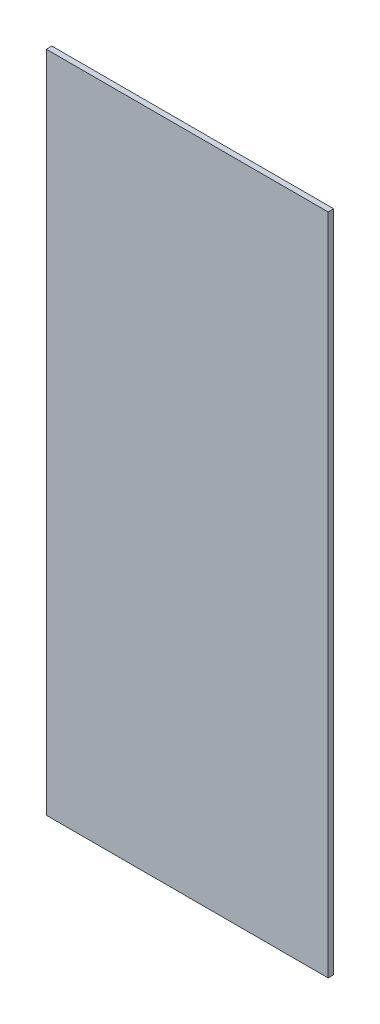
ISO-10303-21;
HEADER;
FILE_DESCRIPTION(('STEP AP214'),'2;1');
FILE_NAME('part.step','',(''),(''),'','','');
FILE_SCHEMA(('AUTOMOTIVE_DESIGN { 1 0 10303 214 1 1 1 1 }'));
ENDSEC;
DATA;
#1=APPLICATION_CONTEXT('core data for automotive mechanical design processes');
#2=APPLICATION_PROTOCOL_DEFINITION('international standard','automotive_design',2000,#1);
#3=PRODUCT_CONTEXT('',#1,'mechanical');
#4=PRODUCT('Part','Part','',(#3));
#5=PRODUCT_RELATED_PRODUCT_CATEGORY('part','',(#4));
#6=PRODUCT_DEFINITION_FORMATION('','',#4);
#7=PRODUCT_DEFINITION_CONTEXT('part definition',#1,'design');
#8=PRODUCT_DEFINITION('design','',#6,#7);
#9=PRODUCT_DEFINITION_SHAPE('','',#8);
#10=(LENGTH_UNIT() NAMED_UNIT(*) SI_UNIT(.MILLI.,.METRE.));
#11=(NAMED_UNIT(*) PLANE_ANGLE_UNIT() SI_UNIT($,.RADIAN.));
#12=(NAMED_UNIT(*) SI_UNIT($,.STERADIAN.) SOLID_ANGLE_UNIT());
#13=UNCERTAINTY_MEASURE_WITH_UNIT(LENGTH_MEASURE(1.E-05),#10,'distance_accuracy_value','');
#14=(GEOMETRIC_REPRESENTATION_CONTEXT(3) GLOBAL_UNCERTAINTY_ASSIGNED_CONTEXT((#13)) GLOBAL_UNIT_ASSIGNED_CONTEXT((#10,
#11,#12)) REPRESENTATION_CONTEXT('',''));
#15=CARTESIAN_POINT('',(0.,0.,0.));
#16=DIRECTION('',(0.,0.,1.));
#17=DIRECTION('',(1.,0.,0.));
#18=AXIS2_PLACEMENT_3D('',#15,#16,#17);
#19=CARTESIAN_POINT('',(0.,0.,12.7));
#20=DIRECTION('',(-1.,0.,0.));
#21=DIRECTION('',(0.,-1.,0.));
#22=AXIS2_PLACEMENT_3D('',#19,#20,#21);
#23=PLANE('',#22);
#24=DIRECTION('',(0.,1.,0.));
#25=VECTOR('',#24,1.);
#26=CARTESIAN_POINT('',(0.,0.,0.));
#27=LINE('',#26,#25);
#28=CARTESIAN_POINT('',(0.,0.,0.));
#29=VERTEX_POINT('',#28);
#30=CARTESIAN_POINT('',(0.,1524.,0.));
#31=VERTEX_POINT('',#30);
#32=EDGE_CURVE('E95',#29,#31,#27,.T.);
#33=ORIENTED_EDGE('',*,*,#32,.T.);
#34=DIRECTION('',(0.,0.,-1.));
#35=VECTOR('',#34,1.);
#36=CARTESIAN_POINT('',(0.,1524.,12.7));
#37=LINE('',#36,#35);
#38=CARTESIAN_POINT('',(0.,1524.,12.7));
#39=VERTEX_POINT('',#38);
#40=EDGE_CURVE('E11',#39,#31,#37,.T.);
#41=ORIENTED_EDGE('',*,*,#40,.F.);
#42=DIRECTION('',(0.,1.,0.));
#43=VECTOR('',#42,1.);
#44=CARTESIAN_POINT('',(0.,0.,12.7));
#45=LINE('',#44,#43);
#46=CARTESIAN_POINT('',(0.,0.,12.7));
#47=VERTEX_POINT('',#46);
#48=EDGE_CURVE('E83',#47,#39,#45,.T.);
#49=ORIENTED_EDGE('',*,*,#48,.F.);
#50=DIRECTION('',(0.,0.,-1.));
#51=VECTOR('',#50,1.);
#52=CARTESIAN_POINT('',(0.,0.,12.7));
#53=LINE('',#52,#51);
#54=EDGE_CURVE('E91',#47,#29,#53,.T.);
#55=ORIENTED_EDGE('',*,*,#54,.T.);
#56=EDGE_LOOP('',(#33,#41,#49,#55));
#57=FACE_BOUND('',#56,.T.);
#58=ADVANCED_FACE('F32',(#57),#23,.F.);
#59=CARTESIAN_POINT('',(0.,1524.,12.7));
#60=DIRECTION('',(0.,-1.,0.));
#61=DIRECTION('',(0.,0.,-1.));
#62=AXIS2_PLACEMENT_3D('',#59,#60,#61);
#63=PLANE('',#62);
#64=DIRECTION('',(-1.,0.,0.));
#65=VECTOR('',#64,1.);
#66=CARTESIAN_POINT('',(0.,1524.,0.));
#67=LINE('',#66,#65);
#68=CARTESIAN_POINT('',(-647.7,1524.,0.));
#69=VERTEX_POINT('',#68);
#70=EDGE_CURVE('E87',#31,#69,#67,.T.);
#71=ORIENTED_EDGE('',*,*,#70,.T.);
#72=DIRECTION('',(0.,0.,-1.));
#73=VECTOR('',#72,1.);
#74=CARTESIAN_POINT('',(-647.7,1524.,12.7));
#75=LINE('',#74,#73);
#76=CARTESIAN_POINT('',(-647.7,1524.,12.7));
#77=VERTEX_POINT('',#76);
#78=EDGE_CURVE('E40',#77,#69,#75,.T.);
#79=ORIENTED_EDGE('',*,*,#78,.F.);
#80=DIRECTION('',(-1.,0.,0.));
#81=VECTOR('',#80,1.);
#82=CARTESIAN_POINT('',(0.,1524.,12.7));
#83=LINE('',#82,#81);
#84=EDGE_CURVE('E78',#39,#77,#83,.T.);
#85=ORIENTED_EDGE('',*,*,#84,.F.);
#86=ORIENTED_EDGE('',*,*,#40,.T.);
#87=EDGE_LOOP('',(#71,#79,#85,#86));
#88=FACE_BOUND('',#87,.T.);
#89=ADVANCED_FACE('F86',(#88),#63,.F.);
#90=CARTESIAN_POINT('',(-647.7,0.,12.7));
#91=DIRECTION('',(1.,0.,0.));
#92=DIRECTION('',(0.,1.,0.));
#93=AXIS2_PLACEMENT_3D('',#90,#91,#92);
#94=PLANE('',#93);
#95=DIRECTION('',(0.,-1.,0.));
#96=VECTOR('',#95,1.);
#97=CARTESIAN_POINT('',(-647.7,0.,0.));
#98=LINE('',#97,#96);
#99=CARTESIAN_POINT('',(-647.7,0.,0.));
#100=VERTEX_POINT('',#99);
#101=EDGE_CURVE('E65',#69,#100,#98,.T.);
#102=ORIENTED_EDGE('',*,*,#101,.T.);
#103=DIRECTION('',(0.,0.,-1.));
#104=VECTOR('',#103,1.);
#105=CARTESIAN_POINT('',(-647.7,0.,12.7));
#106=LINE('',#105,#104);
#107=CARTESIAN_POINT('',(-647.7,0.,12.7));
#108=VERTEX_POINT('',#107);
#109=EDGE_CURVE('E88',#108,#100,#106,.T.);
#110=ORIENTED_EDGE('',*,*,#109,.F.);
#111=DIRECTION('',(0.,-1.,0.));
#112=VECTOR('',#111,1.);
#113=CARTESIAN_POINT('',(-647.7,0.,12.7));
#114=LINE('',#113,#112);
#115=EDGE_CURVE('E81',#77,#108,#114,.T.);
#116=ORIENTED_EDGE('',*,*,#115,.F.);
#117=ORIENTED_EDGE('',*,*,#78,.T.);
#118=EDGE_LOOP('',(#102,#110,#116,#117));
#119=FACE_BOUND('',#118,.T.);
#120=ADVANCED_FACE('F89',(#119),#94,.F.);
#121=CARTESIAN_POINT('',(0.,0.,12.7));
#122=DIRECTION('',(0.,1.,0.));
#123=DIRECTION('',(-1.,0.,0.));
#124=AXIS2_PLACEMENT_3D('',#121,#122,#123);
#125=PLANE('',#124);
#126=DIRECTION('',(1.,0.,0.));
#127=VECTOR('',#126,1.);
#128=CARTESIAN_POINT('',(0.,0.,0.));
#129=LINE('',#128,#127);
#130=EDGE_CURVE('E71',#100,#29,#129,.T.);
#131=ORIENTED_EDGE('',*,*,#130,.T.);
#132=ORIENTED_EDGE('',*,*,#54,.F.);
#133=DIRECTION('',(1.,0.,0.));
#134=VECTOR('',#133,1.);
#135=CARTESIAN_POINT('',(0.,0.,12.7));
#136=LINE('',#135,#134);
#137=EDGE_CURVE('E48',#108,#47,#136,.T.);
#138=ORIENTED_EDGE('',*,*,#137,.F.);
#139=ORIENTED_EDGE('',*,*,#109,.T.);
#140=EDGE_LOOP('',(#131,#132,#138,#139));
#141=FACE_BOUND('',#140,.T.);
#142=ADVANCED_FACE('F102',(#141),#125,.F.);
#143=CARTESIAN_POINT('',(0.,0.,12.7));
#144=DIRECTION('',(0.,0.,1.));
#145=DIRECTION('',(1.,0.,0.));
#146=AXIS2_PLACEMENT_3D('',#143,#144,#145);
#147=PLANE('',#146);
#148=ORIENTED_EDGE('',*,*,#48,.T.);
#149=ORIENTED_EDGE('',*,*,#84,.T.);
#150=ORIENTED_EDGE('',*,*,#115,.T.);
#151=ORIENTED_EDGE('',*,*,#137,.T.);
#152=EDGE_LOOP('',(#148,#149,#150,#151));
#153=FACE_BOUND('',#152,.T.);
#154=ADVANCED_FACE('F79',(#153),#147,.T.);
#155=CARTESIAN_POINT('',(0.,0.,0.));
#156=DIRECTION('',(0.,0.,1.));
#157=DIRECTION('',(1.,0.,0.));
#158=AXIS2_PLACEMENT_3D('',#155,#156,#157);
#159=PLANE('',#158);
#160=ORIENTED_EDGE('',*,*,#32,.F.);
#161=ORIENTED_EDGE('',*,*,#130,.F.);
#162=ORIENTED_EDGE('',*,*,#101,.F.);
#163=ORIENTED_EDGE('',*,*,#70,.F.);
#164=EDGE_LOOP('',(#160,#161,#162,#163));
#165=FACE_BOUND('',#164,.T.);
#166=ADVANCED_FACE('F105',(#165),#159,.F.);
#167=CLOSED_SHELL('',(#58,#89,#120,#142,#154,#166));
#168=MANIFOLD_SOLID_BREP('B2',#167);
#169=ADVANCED_BREP_SHAPE_REPRESENTATION('',(#18,#168),#14);
#170=SHAPE_DEFINITION_REPRESENTATION(#9,#169);
ENDSEC;
END-ISO-10303-21;
